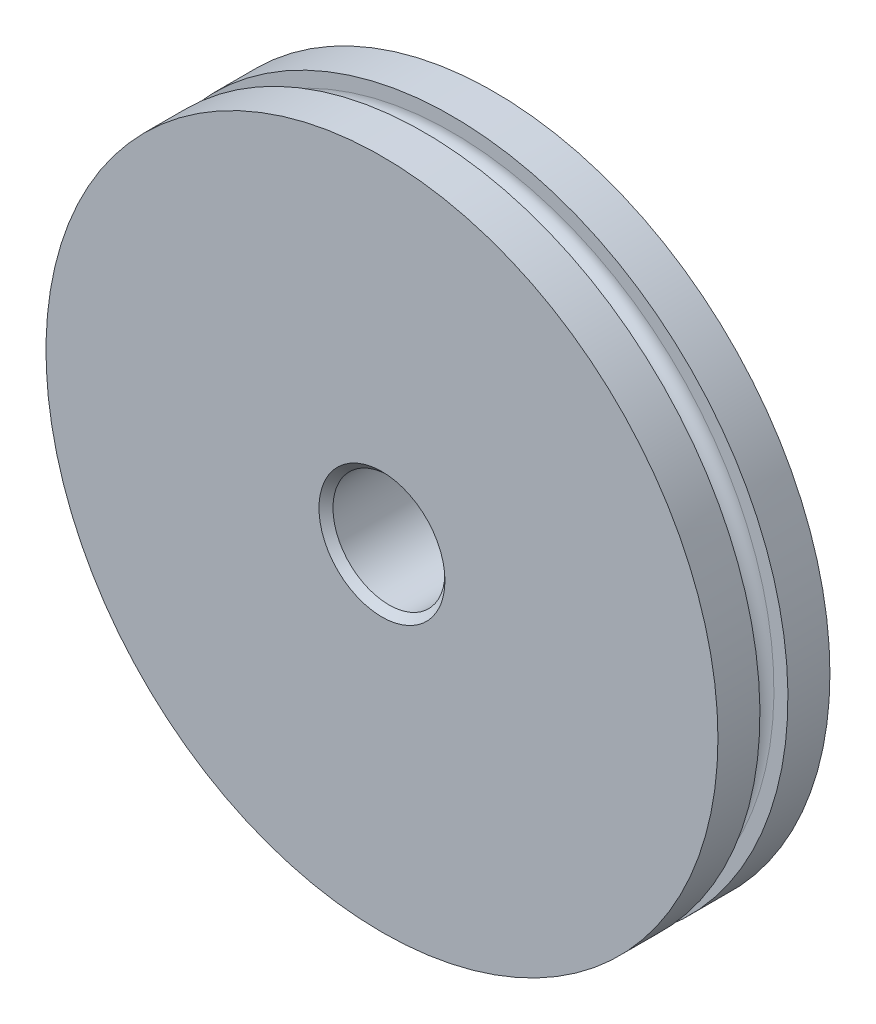
ISO-10303-21;
HEADER;
FILE_DESCRIPTION(('STEP AP214'),'2;1');
FILE_NAME('part.step','',(''),(''),'','','');
FILE_SCHEMA(('AUTOMOTIVE_DESIGN { 1 0 10303 214 1 1 1 1 }'));
ENDSEC;
DATA;
#1=APPLICATION_CONTEXT('core data for automotive mechanical design processes');
#2=APPLICATION_PROTOCOL_DEFINITION('international standard','automotive_design',2000,#1);
#3=PRODUCT_CONTEXT('',#1,'mechanical');
#4=PRODUCT('Part','Part','',(#3));
#5=PRODUCT_RELATED_PRODUCT_CATEGORY('part','',(#4));
#6=PRODUCT_DEFINITION_FORMATION('','',#4);
#7=PRODUCT_DEFINITION_CONTEXT('part definition',#1,'design');
#8=PRODUCT_DEFINITION('design','',#6,#7);
#9=PRODUCT_DEFINITION_SHAPE('','',#8);
#10=(LENGTH_UNIT() NAMED_UNIT(*) SI_UNIT(.MILLI.,.METRE.));
#11=(NAMED_UNIT(*) PLANE_ANGLE_UNIT() SI_UNIT($,.RADIAN.));
#12=(NAMED_UNIT(*) SI_UNIT($,.STERADIAN.) SOLID_ANGLE_UNIT());
#13=UNCERTAINTY_MEASURE_WITH_UNIT(LENGTH_MEASURE(1.E-05),#10,'distance_accuracy_value','');
#14=(GEOMETRIC_REPRESENTATION_CONTEXT(3) GLOBAL_UNCERTAINTY_ASSIGNED_CONTEXT((#13)) GLOBAL_UNIT_ASSIGNED_CONTEXT((#10,
#11,#12)) REPRESENTATION_CONTEXT('',''));
#15=CARTESIAN_POINT('',(0.,0.,0.));
#16=DIRECTION('',(0.,0.,1.));
#17=DIRECTION('',(1.,0.,0.));
#18=AXIS2_PLACEMENT_3D('',#15,#16,#17);
#19=CARTESIAN_POINT('',(0.,0.,6.35));
#20=DIRECTION('',(0.,0.,-1.));
#21=DIRECTION('',(-1.,0.,0.));
#22=AXIS2_PLACEMENT_3D('',#19,#20,#21);
#23=CYLINDRICAL_SURFACE('',#22,38.1);
#24=CARTESIAN_POINT('',(0.,0.,-6.35));
#25=DIRECTION('',(0.,0.,1.));
#26=DIRECTION('',(1.,0.,0.));
#27=AXIS2_PLACEMENT_3D('',#24,#25,#26);
#28=CIRCLE('',#27,38.1);
#29=CARTESIAN_POINT('',(38.1,0.,-6.35));
#30=VERTEX_POINT('',#29);
#31=EDGE_CURVE('E51',#30,#30,#28,.T.);
#32=ORIENTED_EDGE('',*,*,#31,.T.);
#33=EDGE_LOOP('',(#32));
#34=FACE_BOUND('',#33,.T.);
#35=CARTESIAN_POINT('',(0.,0.,-1.58749999999996));
#36=DIRECTION('',(0.,0.,1.));
#37=DIRECTION('',(0.,-1.,0.));
#38=AXIS2_PLACEMENT_3D('',#35,#36,#37);
#39=CIRCLE('',#38,38.1);
#40=CARTESIAN_POINT('',(0.,-38.1,-1.58749999999992));
#41=VERTEX_POINT('',#40);
#42=EDGE_CURVE('E59',#41,#41,#39,.T.);
#43=ORIENTED_EDGE('',*,*,#42,.F.);
#44=EDGE_LOOP('',(#43));
#45=FACE_BOUND('',#44,.T.);
#46=ADVANCED_FACE('F30',(#34,#45),#23,.T.);
#47=CARTESIAN_POINT('',(0.,0.,6.35));
#48=DIRECTION('',(0.,0.,1.));
#49=DIRECTION('',(1.,0.,0.));
#50=AXIS2_PLACEMENT_3D('',#47,#48,#49);
#51=CIRCLE('',#50,38.1);
#52=CARTESIAN_POINT('',(38.1,0.,6.35));
#53=VERTEX_POINT('',#52);
#54=EDGE_CURVE('E50',#53,#53,#51,.T.);
#55=ORIENTED_EDGE('',*,*,#54,.F.);
#56=EDGE_LOOP('',(#55));
#57=FACE_BOUND('',#56,.T.);
#58=CARTESIAN_POINT('',(0.,0.,1.58750000000004));
#59=DIRECTION('',(0.,0.,1.));
#60=DIRECTION('',(0.,-1.,0.));
#61=AXIS2_PLACEMENT_3D('',#58,#59,#60);
#62=CIRCLE('',#61,38.1);
#63=CARTESIAN_POINT('',(0.,-38.1,1.58750000000008));
#64=VERTEX_POINT('',#63);
#65=EDGE_CURVE('E62',#64,#64,#62,.T.);
#66=ORIENTED_EDGE('',*,*,#65,.T.);
#67=EDGE_LOOP('',(#66));
#68=FACE_BOUND('',#67,.T.);
#69=ADVANCED_FACE('F87',(#57,#68),#23,.T.);
#70=CARTESIAN_POINT('',(0.,0.,6.35));
#71=DIRECTION('',(0.,0.,1.));
#72=DIRECTION('',(1.,0.,0.));
#73=AXIS2_PLACEMENT_3D('',#70,#71,#72);
#74=PLANE('',#73);
#75=CARTESIAN_POINT('',(0.,0.,6.35));
#76=DIRECTION('',(0.,0.,1.));
#77=DIRECTION('',(1.,0.,0.));
#78=AXIS2_PLACEMENT_3D('',#75,#76,#77);
#79=CIRCLE('',#78,7.14375);
#80=CARTESIAN_POINT('',(7.14375,0.,6.35));
#81=VERTEX_POINT('',#80);
#82=EDGE_CURVE('E10',#81,#81,#79,.F.);
#83=ORIENTED_EDGE('',*,*,#82,.T.);
#84=EDGE_LOOP('',(#83));
#85=FACE_BOUND('',#84,.T.);
#86=ORIENTED_EDGE('',*,*,#54,.T.);
#87=EDGE_LOOP('',(#86));
#88=FACE_BOUND('',#87,.T.);
#89=ADVANCED_FACE('F93',(#85,#88),#74,.T.);
#90=CARTESIAN_POINT('',(0.,0.,-6.35));
#91=DIRECTION('',(0.,0.,1.));
#92=DIRECTION('',(1.,0.,0.));
#93=AXIS2_PLACEMENT_3D('',#90,#91,#92);
#94=PLANE('',#93);
#95=CARTESIAN_POINT('',(0.,0.,-6.35));
#96=DIRECTION('',(0.,0.,1.));
#97=DIRECTION('',(1.,0.,0.));
#98=AXIS2_PLACEMENT_3D('',#95,#96,#97);
#99=CIRCLE('',#98,7.14375);
#100=CARTESIAN_POINT('',(-7.14375,0.,-6.35));
#101=VERTEX_POINT('',#100);
#102=EDGE_CURVE('E45',#101,#101,#99,.T.);
#103=ORIENTED_EDGE('',*,*,#102,.T.);
#104=EDGE_LOOP('',(#103));
#105=FACE_BOUND('',#104,.T.);
#106=ORIENTED_EDGE('',*,*,#31,.F.);
#107=EDGE_LOOP('',(#106));
#108=FACE_BOUND('',#107,.T.);
#109=ADVANCED_FACE('F97',(#105,#108),#94,.F.);
#110=CARTESIAN_POINT('',(0.,0.,6.35));
#111=DIRECTION('',(0.,0.,-1.));
#112=DIRECTION('',(-1.,0.,0.));
#113=AXIS2_PLACEMENT_3D('',#110,#111,#112);
#114=CYLINDRICAL_SURFACE('',#113,6.35);
#115=CARTESIAN_POINT('',(0.,0.,-5.55625000000001));
#116=DIRECTION('',(0.,0.,1.));
#117=DIRECTION('',(1.,0.,0.));
#118=AXIS2_PLACEMENT_3D('',#115,#116,#117);
#119=CIRCLE('',#118,6.35);
#120=CARTESIAN_POINT('',(-6.35,0.,-5.55625000000002));
#121=VERTEX_POINT('',#120);
#122=EDGE_CURVE('E37',#121,#121,#119,.F.);
#123=ORIENTED_EDGE('',*,*,#122,.T.);
#124=EDGE_LOOP('',(#123));
#125=FACE_BOUND('',#124,.T.);
#126=CARTESIAN_POINT('',(0.,0.,5.55624999999999));
#127=DIRECTION('',(0.,0.,1.));
#128=DIRECTION('',(1.,0.,0.));
#129=AXIS2_PLACEMENT_3D('',#126,#127,#128);
#130=CIRCLE('',#129,6.35);
#131=CARTESIAN_POINT('',(6.35,0.,5.55624999999999));
#132=VERTEX_POINT('',#131);
#133=EDGE_CURVE('E41',#132,#132,#130,.T.);
#134=ORIENTED_EDGE('',*,*,#133,.T.);
#135=EDGE_LOOP('',(#134));
#136=FACE_BOUND('',#135,.T.);
#137=ADVANCED_FACE('F100',(#125,#136),#114,.F.);
#138=CARTESIAN_POINT('',(0.,0.,-6.35));
#139=DIRECTION('',(0.,0.,-1.));
#140=DIRECTION('',(-1.,0.,0.));
#141=AXIS2_PLACEMENT_3D('',#138,#139,#140);
#142=CONICAL_SURFACE('',#141,7.14375,0.78539816339746);
#143=CARTESIAN_POINT('',(-6.35,0.,-5.55625000000002));
#144=CARTESIAN_POINT('',(-6.35826822916667,0.,-5.56451822916668));
#145=CARTESIAN_POINT('',(-6.36653645833333,0.,-5.57278645833335));
#146=CARTESIAN_POINT('',(-6.38307291666667,0.,-5.58932291666668));
#147=CARTESIAN_POINT('',(-6.39134114583333,0.,-5.59759114583335));
#148=CARTESIAN_POINT('',(-6.40787760416667,0.,-5.61412760416668));
#149=CARTESIAN_POINT('',(-6.41614583333333,0.,-5.62239583333335));
#150=CARTESIAN_POINT('',(-6.43268229166667,0.,-5.63893229166668));
#151=CARTESIAN_POINT('',(-6.44095052083333,0.,-5.64720052083335));
#152=CARTESIAN_POINT('',(-6.45748697916667,0.,-5.66373697916668));
#153=CARTESIAN_POINT('',(-6.46575520833333,0.,-5.67200520833335));
#154=CARTESIAN_POINT('',(-6.48229166666667,0.,-5.68854166666668));
#155=CARTESIAN_POINT('',(-6.49055989583333,0.,-5.69680989583335));
#156=CARTESIAN_POINT('',(-6.50709635416667,0.,-5.71334635416668));
#157=CARTESIAN_POINT('',(-6.51536458333333,0.,-5.72161458333334));
#158=CARTESIAN_POINT('',(-6.53190104166667,0.,-5.73815104166668));
#159=CARTESIAN_POINT('',(-6.54016927083333,0.,-5.74641927083335));
#160=CARTESIAN_POINT('',(-6.55670572916667,0.,-5.76295572916668));
#161=CARTESIAN_POINT('',(-6.56497395833333,0.,-5.77122395833335));
#162=CARTESIAN_POINT('',(-6.58151041666667,0.,-5.78776041666668));
#163=CARTESIAN_POINT('',(-6.58977864583334,0.,-5.79602864583334));
#164=CARTESIAN_POINT('',(-6.60631510416667,0.,-5.81256510416668));
#165=CARTESIAN_POINT('',(-6.61458333333333,0.,-5.82083333333334));
#166=CARTESIAN_POINT('',(-6.63111979166667,0.,-5.83736979166668));
#167=CARTESIAN_POINT('',(-6.63938802083333,0.,-5.84563802083334));
#168=CARTESIAN_POINT('',(-6.65592447916667,0.,-5.86217447916668));
#169=CARTESIAN_POINT('',(-6.66419270833333,0.,-5.87044270833334));
#170=CARTESIAN_POINT('',(-6.68072916666667,0.,-5.88697916666668));
#171=CARTESIAN_POINT('',(-6.68899739583334,0.,-5.89524739583334));
#172=CARTESIAN_POINT('',(-6.70553385416667,0.,-5.91178385416667));
#173=CARTESIAN_POINT('',(-6.71380208333334,0.,-5.92005208333334));
#174=CARTESIAN_POINT('',(-6.73033854166667,0.,-5.93658854166667));
#175=CARTESIAN_POINT('',(-6.73860677083333,0.,-5.94485677083334));
#176=CARTESIAN_POINT('',(-6.75514322916667,0.,-5.96139322916667));
#177=CARTESIAN_POINT('',(-6.76341145833334,0.,-5.96966145833334));
#178=CARTESIAN_POINT('',(-6.77994791666667,0.,-5.98619791666667));
#179=CARTESIAN_POINT('',(-6.78821614583334,0.,-5.99446614583334));
#180=CARTESIAN_POINT('',(-6.80475260416667,0.,-6.01100260416667));
#181=CARTESIAN_POINT('',(-6.81302083333334,0.,-6.01927083333334));
#182=CARTESIAN_POINT('',(-6.82955729166667,0.,-6.03580729166667));
#183=CARTESIAN_POINT('',(-6.83782552083334,0.,-6.04407552083334));
#184=CARTESIAN_POINT('',(-6.85436197916667,0.,-6.06061197916667));
#185=CARTESIAN_POINT('',(-6.86263020833334,0.,-6.06888020833334));
#186=CARTESIAN_POINT('',(-6.87916666666667,0.,-6.08541666666667));
#187=CARTESIAN_POINT('',(-6.88743489583334,0.,-6.09368489583334));
#188=CARTESIAN_POINT('',(-6.90397135416667,0.,-6.11022135416667));
#189=CARTESIAN_POINT('',(-6.91223958333334,0.,-6.11848958333334));
#190=CARTESIAN_POINT('',(-6.92877604166667,0.,-6.13502604166667));
#191=CARTESIAN_POINT('',(-6.93704427083334,0.,-6.14329427083334));
#192=CARTESIAN_POINT('',(-6.95358072916667,0.,-6.15983072916667));
#193=CARTESIAN_POINT('',(-6.96184895833334,0.,-6.16809895833334));
#194=CARTESIAN_POINT('',(-6.97838541666667,0.,-6.18463541666667));
#195=CARTESIAN_POINT('',(-6.98665364583334,0.,-6.19290364583334));
#196=CARTESIAN_POINT('',(-7.00319010416667,0.,-6.20944010416667));
#197=CARTESIAN_POINT('',(-7.01145833333334,0.,-6.21770833333334));
#198=CARTESIAN_POINT('',(-7.02799479166667,0.,-6.23424479166667));
#199=CARTESIAN_POINT('',(-7.03626302083334,0.,-6.24251302083334));
#200=CARTESIAN_POINT('',(-7.05279947916667,0.,-6.25904947916667));
#201=CARTESIAN_POINT('',(-7.06106770833334,0.,-6.26731770833334));
#202=CARTESIAN_POINT('',(-7.07760416666667,0.,-6.28385416666667));
#203=CARTESIAN_POINT('',(-7.08587239583334,0.,-6.29212239583333));
#204=CARTESIAN_POINT('',(-7.10240885416667,0.,-6.30865885416667));
#205=CARTESIAN_POINT('',(-7.11067708333334,0.,-6.31692708333333));
#206=CARTESIAN_POINT('',(-7.12721354166667,0.,-6.33346354166667));
#207=CARTESIAN_POINT('',(-7.13548177083334,0.,-6.34173177083333));
#208=CARTESIAN_POINT('',(-7.14375,0.,-6.35));
#209=B_SPLINE_CURVE_WITH_KNOTS('',3,(#143,#144,#145,#146,#147,#148,#149,#150,#151,#152,#153,
#154,#155,#156,#157,#158,#159,#160,#161,#162,#163,#164,#165,#166,#167,#168,#169,#170,#171,#172,
#173,#174,#175,#176,#177,#178,#179,#180,#181,#182,#183,#184,#185,#186,#187,#188,#189,#190,#191,
#192,#193,#194,#195,#196,#197,#198,#199,#200,#201,#202,#203,#204,#205,#206,#207,#208),
.UNSPECIFIED.,.F.,.F.,(4,2,2,2,2,2,2,2,2,2,2,2,2,2,2,2,2,2,2,2,2,2,2,2,2,2,2,2,2,2,2,2,4),(0.,
0.0350791254729256,0.0701582509458518,0.105237376418778,0.140316501891704,0.17539562736463,
0.210474752837556,0.245553878310483,0.280633003783409,0.315712129256335,0.350791254729261,
0.385870380202187,0.420949505675113,0.456028631148039,0.491107756620966,0.526186882093891,
0.561266007566818,0.596345133039744,0.63142425851267,0.666503383985596,0.701582509458522,
0.736661634931448,0.771740760404375,0.8068198858773,0.841899011350227,0.876978136823153,
0.91205726229608,0.947136387769006,0.982215513241931,1.01729463871486,1.05237376418778,
1.08745288966071,1.12253201513364),.UNSPECIFIED.);
#210=EDGE_CURVE('BSEAM83',#121,#101,#209,.T.);
#211=ORIENTED_EDGE('',*,*,#122,.F.);
#212=ORIENTED_EDGE('',*,*,#102,.F.);
#213=ORIENTED_EDGE('',*,*,#210,.T.);
#214=ORIENTED_EDGE('',*,*,#210,.F.);
#215=EDGE_LOOP('',(#211,#213,#212,#214));
#216=FACE_BOUND('',#215,.T.);
#217=ADVANCED_FACE('F83',(#216),#142,.F.);
#218=CARTESIAN_POINT('',(0.,0.,5.55624999999999));
#219=DIRECTION('',(0.,0.,1.));
#220=DIRECTION('',(1.,0.,0.));
#221=AXIS2_PLACEMENT_3D('',#218,#219,#220);
#222=CONICAL_SURFACE('',#221,6.35,0.785398163397445);
#223=ORIENTED_EDGE('',*,*,#82,.F.);
#224=EDGE_LOOP('',(#223));
#225=FACE_BOUND('',#224,.T.);
#226=ORIENTED_EDGE('',*,*,#133,.F.);
#227=EDGE_LOOP('',(#226));
#228=FACE_BOUND('',#227,.T.);
#229=ADVANCED_FACE('F32',(#225,#228),#222,.F.);
#230=CARTESIAN_POINT('',(0.,0.,0.));
#231=DIRECTION('',(0.,0.,1.));
#232=DIRECTION('',(0.,-1.,0.));
#233=AXIS2_PLACEMENT_3D('',#230,#231,#232);
#234=TOROIDAL_SURFACE('',#233,36.5125,1.5875);
#235=CARTESIAN_POINT('',(0.,0.,-1.58749999999996));
#236=DIRECTION('',(0.,0.,1.));
#237=DIRECTION('',(0.,-1.,0.));
#238=AXIS2_PLACEMENT_3D('',#235,#236,#237);
#239=CIRCLE('',#238,36.5125);
#240=CARTESIAN_POINT('',(0.,-36.5125,-1.58749999999992));
#241=VERTEX_POINT('',#240);
#242=EDGE_CURVE('E54',#241,#241,#239,.T.);
#243=ORIENTED_EDGE('',*,*,#242,.T.);
#244=EDGE_LOOP('',(#243));
#245=FACE_BOUND('',#244,.T.);
#246=CARTESIAN_POINT('',(0.,0.,1.58750000000004));
#247=DIRECTION('',(0.,0.,1.));
#248=DIRECTION('',(0.,-1.,0.));
#249=AXIS2_PLACEMENT_3D('',#246,#247,#248);
#250=CIRCLE('',#249,36.5125);
#251=CARTESIAN_POINT('',(0.,-36.5125,1.58750000000008));
#252=VERTEX_POINT('',#251);
#253=EDGE_CURVE('E65',#252,#252,#250,.T.);
#254=ORIENTED_EDGE('',*,*,#253,.F.);
#255=EDGE_LOOP('',(#254));
#256=FACE_BOUND('',#255,.T.);
#257=ADVANCED_FACE('F72',(#245,#256),#234,.F.);
#258=CARTESIAN_POINT('',(0.,36.5125,-1.5875));
#259=DIRECTION('',(0.,0.,1.));
#260=DIRECTION('',(0.,-1.,0.));
#261=AXIS2_PLACEMENT_3D('',#258,#259,#260);
#262=PLANE('',#261);
#263=ORIENTED_EDGE('',*,*,#42,.T.);
#264=EDGE_LOOP('',(#263));
#265=FACE_BOUND('',#264,.T.);
#266=ORIENTED_EDGE('',*,*,#242,.F.);
#267=EDGE_LOOP('',(#266));
#268=FACE_BOUND('',#267,.T.);
#269=ADVANCED_FACE('F74',(#265,#268),#262,.T.);
#270=CARTESIAN_POINT('',(0.,36.5125,1.5875));
#271=DIRECTION('',(0.,0.,-1.));
#272=DIRECTION('',(0.,1.,0.));
#273=AXIS2_PLACEMENT_3D('',#270,#271,#272);
#274=PLANE('',#273);
#275=ORIENTED_EDGE('',*,*,#253,.T.);
#276=EDGE_LOOP('',(#275));
#277=FACE_BOUND('',#276,.T.);
#278=ORIENTED_EDGE('',*,*,#65,.F.);
#279=EDGE_LOOP('',(#278));
#280=FACE_BOUND('',#279,.T.);
#281=ADVANCED_FACE('F69',(#277,#280),#274,.T.);
#282=CLOSED_SHELL('',(#46,#69,#89,#109,#137,#217,#229,#257,#269,#281));
#283=MANIFOLD_SOLID_BREP('B2',#282);
#284=ADVANCED_BREP_SHAPE_REPRESENTATION('',(#18,#283),#14);
#285=SHAPE_DEFINITION_REPRESENTATION(#9,#284);
ENDSEC;
END-ISO-10303-21;
